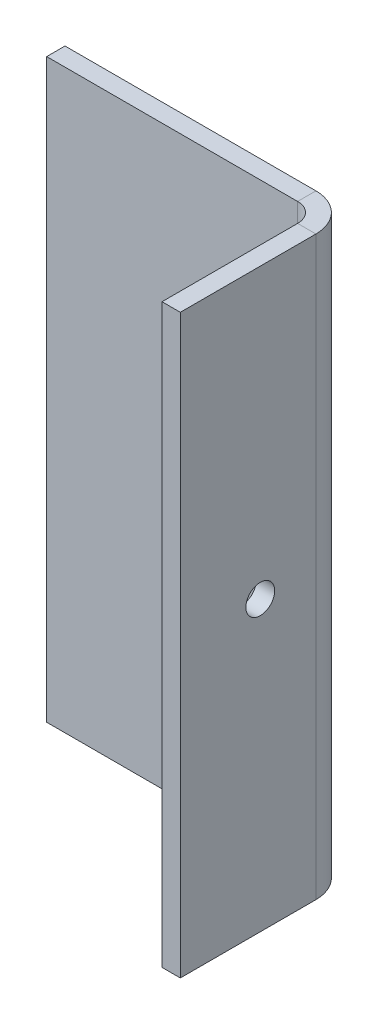
ISO-10303-21;
HEADER;
FILE_DESCRIPTION(('STEP AP214'),'2;1');
FILE_NAME('part.step','',(''),(''),'','','');
FILE_SCHEMA(('AUTOMOTIVE_DESIGN { 1 0 10303 214 1 1 1 1 }'));
ENDSEC;
DATA;
#1=APPLICATION_CONTEXT('core data for automotive mechanical design processes');
#2=APPLICATION_PROTOCOL_DEFINITION('international standard','automotive_design',2000,#1);
#3=PRODUCT_CONTEXT('',#1,'mechanical');
#4=PRODUCT('Part','Part','',(#3));
#5=PRODUCT_RELATED_PRODUCT_CATEGORY('part','',(#4));
#6=PRODUCT_DEFINITION_FORMATION('','',#4);
#7=PRODUCT_DEFINITION_CONTEXT('part definition',#1,'design');
#8=PRODUCT_DEFINITION('design','',#6,#7);
#9=PRODUCT_DEFINITION_SHAPE('','',#8);
#10=(LENGTH_UNIT() NAMED_UNIT(*) SI_UNIT(.MILLI.,.METRE.));
#11=(NAMED_UNIT(*) PLANE_ANGLE_UNIT() SI_UNIT($,.RADIAN.));
#12=(NAMED_UNIT(*) SI_UNIT($,.STERADIAN.) SOLID_ANGLE_UNIT());
#13=UNCERTAINTY_MEASURE_WITH_UNIT(LENGTH_MEASURE(1.E-05),#10,'distance_accuracy_value','');
#14=(GEOMETRIC_REPRESENTATION_CONTEXT(3) GLOBAL_UNCERTAINTY_ASSIGNED_CONTEXT((#13)) GLOBAL_UNIT_ASSIGNED_CONTEXT((#10,
#11,#12)) REPRESENTATION_CONTEXT('',''));
#15=CARTESIAN_POINT('',(0.,0.,0.));
#16=DIRECTION('',(0.,0.,1.));
#17=DIRECTION('',(1.,0.,0.));
#18=AXIS2_PLACEMENT_3D('',#15,#16,#17);
#19=CARTESIAN_POINT('',(-25.,50.,-3.175));
#20=DIRECTION('',(0.,1.,0.));
#21=DIRECTION('',(0.,0.,1.));
#22=AXIS2_PLACEMENT_3D('',#19,#20,#21);
#23=PLANE('',#22);
#24=DIRECTION('',(-1.,0.,0.));
#25=VECTOR('',#24,1.);
#26=CARTESIAN_POINT('',(-25.,50.,0.));
#27=LINE('',#26,#25);
#28=CARTESIAN_POINT('',(18.523,50.,0.));
#29=VERTEX_POINT('',#28);
#30=CARTESIAN_POINT('',(-25.,50.,0.));
#31=VERTEX_POINT('',#30);
#32=EDGE_CURVE('E91',#29,#31,#27,.T.);
#33=ORIENTED_EDGE('',*,*,#32,.F.);
#34=DIRECTION('',(0.,0.,-1.));
#35=VECTOR('',#34,1.);
#36=CARTESIAN_POINT('',(18.523,50.,0.));
#37=LINE('',#36,#35);
#38=CARTESIAN_POINT('',(18.523,50.,-3.175));
#39=VERTEX_POINT('',#38);
#40=EDGE_CURVE('E107',#29,#39,#37,.T.);
#41=ORIENTED_EDGE('',*,*,#40,.T.);
#42=DIRECTION('',(-1.,0.,0.));
#43=VECTOR('',#42,1.);
#44=CARTESIAN_POINT('',(-25.,50.,-3.175));
#45=LINE('',#44,#43);
#46=CARTESIAN_POINT('',(-25.,50.,-3.175));
#47=VERTEX_POINT('',#46);
#48=EDGE_CURVE('E80',#39,#47,#45,.T.);
#49=ORIENTED_EDGE('',*,*,#48,.T.);
#50=DIRECTION('',(0.,0.,1.));
#51=VECTOR('',#50,1.);
#52=CARTESIAN_POINT('',(-25.,50.,-3.175));
#53=LINE('',#52,#51);
#54=EDGE_CURVE('E13',#47,#31,#53,.T.);
#55=ORIENTED_EDGE('',*,*,#54,.T.);
#56=EDGE_LOOP('',(#33,#41,#49,#55));
#57=FACE_BOUND('',#56,.T.);
#58=ADVANCED_FACE('F57',(#57),#23,.T.);
#59=CARTESIAN_POINT('',(0.,0.,-3.175));
#60=DIRECTION('',(0.,0.,1.));
#61=DIRECTION('',(1.,0.,0.));
#62=AXIS2_PLACEMENT_3D('',#59,#60,#61);
#63=PLANE('',#62);
#64=DIRECTION('',(0.,1.,0.));
#65=VECTOR('',#64,1.);
#66=CARTESIAN_POINT('',(18.523,50.,-3.175));
#67=LINE('',#66,#65);
#68=CARTESIAN_POINT('',(18.523,-50.,-3.175));
#69=VERTEX_POINT('',#68);
#70=EDGE_CURVE('E128',#39,#69,#67,.F.);
#71=ORIENTED_EDGE('',*,*,#70,.T.);
#72=DIRECTION('',(1.,0.,0.));
#73=VECTOR('',#72,1.);
#74=CARTESIAN_POINT('',(-25.,-50.,-3.175));
#75=LINE('',#74,#73);
#76=CARTESIAN_POINT('',(-25.,-50.,-3.175));
#77=VERTEX_POINT('',#76);
#78=EDGE_CURVE('E111',#77,#69,#75,.T.);
#79=ORIENTED_EDGE('',*,*,#78,.F.);
#80=DIRECTION('',(0.,-1.,0.));
#81=VECTOR('',#80,1.);
#82=CARTESIAN_POINT('',(-25.,50.,-3.175));
#83=LINE('',#82,#81);
#84=EDGE_CURVE('E96',#47,#77,#83,.T.);
#85=ORIENTED_EDGE('',*,*,#84,.F.);
#86=ORIENTED_EDGE('',*,*,#48,.F.);
#87=EDGE_LOOP('',(#71,#79,#85,#86));
#88=FACE_BOUND('',#87,.T.);
#89=ADVANCED_FACE('F224',(#88),#63,.F.);
#90=CARTESIAN_POINT('',(0.,0.,0.));
#91=DIRECTION('',(0.,0.,1.));
#92=DIRECTION('',(1.,0.,0.));
#93=AXIS2_PLACEMENT_3D('',#90,#91,#92);
#94=PLANE('',#93);
#95=DIRECTION('',(1.,0.,0.));
#96=VECTOR('',#95,1.);
#97=CARTESIAN_POINT('',(-25.,-50.,0.));
#98=LINE('',#97,#96);
#99=CARTESIAN_POINT('',(-25.,-50.,0.));
#100=VERTEX_POINT('',#99);
#101=CARTESIAN_POINT('',(18.523,-50.,0.));
#102=VERTEX_POINT('',#101);
#103=EDGE_CURVE('E97',#100,#102,#98,.T.);
#104=ORIENTED_EDGE('',*,*,#103,.T.);
#105=DIRECTION('',(0.,1.,0.));
#106=VECTOR('',#105,1.);
#107=CARTESIAN_POINT('',(18.523,50.,0.));
#108=LINE('',#107,#106);
#109=EDGE_CURVE('E72',#29,#102,#108,.F.);
#110=ORIENTED_EDGE('',*,*,#109,.F.);
#111=ORIENTED_EDGE('',*,*,#32,.T.);
#112=DIRECTION('',(0.,-1.,0.));
#113=VECTOR('',#112,1.);
#114=CARTESIAN_POINT('',(-25.,50.,0.));
#115=LINE('',#114,#113);
#116=EDGE_CURVE('E94',#31,#100,#115,.T.);
#117=ORIENTED_EDGE('',*,*,#116,.T.);
#118=EDGE_LOOP('',(#104,#110,#111,#117));
#119=FACE_BOUND('',#118,.T.);
#120=ADVANCED_FACE('F92',(#119),#94,.T.);
#121=CARTESIAN_POINT('',(-25.,50.,-3.175));
#122=DIRECTION('',(-1.,0.,0.));
#123=DIRECTION('',(0.,0.,1.));
#124=AXIS2_PLACEMENT_3D('',#121,#122,#123);
#125=PLANE('',#124);
#126=ORIENTED_EDGE('',*,*,#116,.F.);
#127=ORIENTED_EDGE('',*,*,#54,.F.);
#128=ORIENTED_EDGE('',*,*,#84,.T.);
#129=DIRECTION('',(0.,0.,1.));
#130=VECTOR('',#129,1.);
#131=CARTESIAN_POINT('',(-25.,-50.,-3.175));
#132=LINE('',#131,#130);
#133=EDGE_CURVE('E61',#77,#100,#132,.T.);
#134=ORIENTED_EDGE('',*,*,#133,.T.);
#135=EDGE_LOOP('',(#126,#127,#128,#134));
#136=FACE_BOUND('',#135,.T.);
#137=ADVANCED_FACE('F59',(#136),#125,.T.);
#138=CARTESIAN_POINT('',(-25.,-50.,-3.175));
#139=DIRECTION('',(0.,-1.,0.));
#140=DIRECTION('',(0.,0.,-1.));
#141=AXIS2_PLACEMENT_3D('',#138,#139,#140);
#142=PLANE('',#141);
#143=DIRECTION('',(0.,0.,-1.));
#144=VECTOR('',#143,1.);
#145=CARTESIAN_POINT('',(18.523,-50.,0.));
#146=LINE('',#145,#144);
#147=EDGE_CURVE('E103',#102,#69,#146,.T.);
#148=ORIENTED_EDGE('',*,*,#147,.F.);
#149=ORIENTED_EDGE('',*,*,#103,.F.);
#150=ORIENTED_EDGE('',*,*,#133,.F.);
#151=ORIENTED_EDGE('',*,*,#78,.T.);
#152=EDGE_LOOP('',(#148,#149,#150,#151));
#153=FACE_BOUND('',#152,.T.);
#154=ADVANCED_FACE('F226',(#153),#142,.T.);
#155=CARTESIAN_POINT('',(18.523,-50.,3.302));
#156=DIRECTION('',(0.,-1.,0.));
#157=DIRECTION('',(0.,0.,-1.));
#158=AXIS2_PLACEMENT_3D('',#155,#156,#157);
#159=PLANE('',#158);
#160=DIRECTION('',(-1.,0.,0.));
#161=VECTOR('',#160,1.);
#162=CARTESIAN_POINT('',(25.,-50.,3.30199999999998));
#163=LINE('',#162,#161);
#164=CARTESIAN_POINT('',(21.825,-50.,3.30199999999999));
#165=VERTEX_POINT('',#164);
#166=CARTESIAN_POINT('',(25.,-50.,3.30199999999998));
#167=VERTEX_POINT('',#166);
#168=EDGE_CURVE('E133',#165,#167,#163,.F.);
#169=ORIENTED_EDGE('',*,*,#168,.F.);
#170=CARTESIAN_POINT('',(18.523,-50.,3.302));
#171=DIRECTION('',(0.,1.,0.));
#172=DIRECTION('',(0.,0.,1.));
#173=AXIS2_PLACEMENT_3D('',#170,#171,#172);
#174=CIRCLE('',#173,3.302);
#175=EDGE_CURVE('E122',#102,#165,#174,.F.);
#176=ORIENTED_EDGE('',*,*,#175,.F.);
#177=ORIENTED_EDGE('',*,*,#147,.T.);
#178=CARTESIAN_POINT('',(18.523,-50.,3.302));
#179=DIRECTION('',(0.,1.,0.));
#180=DIRECTION('',(0.,0.,1.));
#181=AXIS2_PLACEMENT_3D('',#178,#179,#180);
#182=CIRCLE('',#181,6.477);
#183=EDGE_CURVE('E115',#69,#167,#182,.F.);
#184=ORIENTED_EDGE('',*,*,#183,.T.);
#185=EDGE_LOOP('',(#169,#176,#177,#184));
#186=FACE_BOUND('',#185,.T.);
#187=ADVANCED_FACE('F229',(#186),#159,.T.);
#188=CARTESIAN_POINT('',(18.523,50.,3.302));
#189=DIRECTION('',(0.,-1.,0.));
#190=DIRECTION('',(0.,0.,-1.));
#191=AXIS2_PLACEMENT_3D('',#188,#189,#190);
#192=PLANE('',#191);
#193=CARTESIAN_POINT('',(18.523,50.,3.302));
#194=DIRECTION('',(0.,1.,0.));
#195=DIRECTION('',(0.,0.,1.));
#196=AXIS2_PLACEMENT_3D('',#193,#194,#195);
#197=CIRCLE('',#196,3.302);
#198=CARTESIAN_POINT('',(21.825,50.,3.30199999999999));
#199=VERTEX_POINT('',#198);
#200=EDGE_CURVE('E117',#199,#29,#197,.T.);
#201=ORIENTED_EDGE('',*,*,#200,.F.);
#202=DIRECTION('',(-1.,0.,0.));
#203=VECTOR('',#202,1.);
#204=CARTESIAN_POINT('',(21.825,50.,3.30199999999999));
#205=LINE('',#204,#203);
#206=CARTESIAN_POINT('',(25.,50.,3.30199999999998));
#207=VERTEX_POINT('',#206);
#208=EDGE_CURVE('E140',#199,#207,#205,.F.);
#209=ORIENTED_EDGE('',*,*,#208,.T.);
#210=CARTESIAN_POINT('',(18.523,50.,3.302));
#211=DIRECTION('',(0.,1.,0.));
#212=DIRECTION('',(0.,0.,1.));
#213=AXIS2_PLACEMENT_3D('',#210,#211,#212);
#214=CIRCLE('',#213,6.477);
#215=EDGE_CURVE('E125',#207,#39,#214,.T.);
#216=ORIENTED_EDGE('',*,*,#215,.T.);
#217=ORIENTED_EDGE('',*,*,#40,.F.);
#218=EDGE_LOOP('',(#201,#209,#216,#217));
#219=FACE_BOUND('',#218,.T.);
#220=ADVANCED_FACE('F233',(#219),#192,.F.);
#221=CARTESIAN_POINT('',(18.523,50.,3.302));
#222=DIRECTION('',(0.,1.,0.));
#223=DIRECTION('',(1.,0.,0.));
#224=AXIS2_PLACEMENT_3D('',#221,#222,#223);
#225=CYLINDRICAL_SURFACE('',#224,6.477);
#226=ORIENTED_EDGE('',*,*,#70,.F.);
#227=ORIENTED_EDGE('',*,*,#215,.F.);
#228=DIRECTION('',(0.,1.,0.));
#229=VECTOR('',#228,1.);
#230=CARTESIAN_POINT('',(25.,-50.,3.30199999999998));
#231=LINE('',#230,#229);
#232=EDGE_CURVE('E143',#207,#167,#231,.F.);
#233=ORIENTED_EDGE('',*,*,#232,.T.);
#234=ORIENTED_EDGE('',*,*,#183,.F.);
#235=EDGE_LOOP('',(#226,#227,#233,#234));
#236=FACE_BOUND('',#235,.T.);
#237=ADVANCED_FACE('F230',(#236),#225,.T.);
#238=CARTESIAN_POINT('',(18.523,50.,3.302));
#239=DIRECTION('',(0.,1.,0.));
#240=DIRECTION('',(1.,0.,0.));
#241=AXIS2_PLACEMENT_3D('',#238,#239,#240);
#242=CYLINDRICAL_SURFACE('',#241,3.302);
#243=ORIENTED_EDGE('',*,*,#109,.T.);
#244=ORIENTED_EDGE('',*,*,#175,.T.);
#245=DIRECTION('',(0.,1.,0.));
#246=VECTOR('',#245,1.);
#247=CARTESIAN_POINT('',(21.825,-50.,3.30199999999999));
#248=LINE('',#247,#246);
#249=EDGE_CURVE('E136',#165,#199,#248,.T.);
#250=ORIENTED_EDGE('',*,*,#249,.T.);
#251=ORIENTED_EDGE('',*,*,#200,.T.);
#252=EDGE_LOOP('',(#243,#244,#250,#251));
#253=FACE_BOUND('',#252,.T.);
#254=ADVANCED_FACE('F232',(#253),#242,.F.);
#255=CARTESIAN_POINT('',(25.,-50.,0.));
#256=DIRECTION('',(0.,1.,0.));
#257=DIRECTION('',(0.,0.,1.));
#258=AXIS2_PLACEMENT_3D('',#255,#256,#257);
#259=PLANE('',#258);
#260=ORIENTED_EDGE('',*,*,#168,.T.);
#261=DIRECTION('',(0.,0.,-1.));
#262=VECTOR('',#261,1.);
#263=CARTESIAN_POINT('',(25.,-50.,0.));
#264=LINE('',#263,#262);
#265=CARTESIAN_POINT('',(25.0000000000001,-50.,26.825));
#266=VERTEX_POINT('',#265);
#267=EDGE_CURVE('E155',#266,#167,#264,.T.);
#268=ORIENTED_EDGE('',*,*,#267,.F.);
#269=DIRECTION('',(-1.,0.,0.));
#270=VECTOR('',#269,1.);
#271=CARTESIAN_POINT('',(25.0000000000001,-50.,26.825));
#272=LINE('',#271,#270);
#273=CARTESIAN_POINT('',(21.8250000000001,-50.,26.825));
#274=VERTEX_POINT('',#273);
#275=EDGE_CURVE('E164',#266,#274,#272,.T.);
#276=ORIENTED_EDGE('',*,*,#275,.T.);
#277=DIRECTION('',(0.,0.,1.));
#278=VECTOR('',#277,1.);
#279=CARTESIAN_POINT('',(21.825,-50.,0.));
#280=LINE('',#279,#278);
#281=EDGE_CURVE('E146',#274,#165,#280,.F.);
#282=ORIENTED_EDGE('',*,*,#281,.T.);
#283=EDGE_LOOP('',(#260,#268,#276,#282));
#284=FACE_BOUND('',#283,.T.);
#285=ADVANCED_FACE('F239',(#284),#259,.F.);
#286=CARTESIAN_POINT('',(25.0000000000001,50.,26.825));
#287=DIRECTION('',(0.,-1.,0.));
#288=DIRECTION('',(0.,0.,-1.));
#289=AXIS2_PLACEMENT_3D('',#286,#287,#288);
#290=PLANE('',#289);
#291=ORIENTED_EDGE('',*,*,#208,.F.);
#292=DIRECTION('',(0.,0.,-1.));
#293=VECTOR('',#292,1.);
#294=CARTESIAN_POINT('',(21.8250000000001,50.,26.825));
#295=LINE('',#294,#293);
#296=CARTESIAN_POINT('',(21.8250000000001,50.,26.825));
#297=VERTEX_POINT('',#296);
#298=EDGE_CURVE('E149',#199,#297,#295,.F.);
#299=ORIENTED_EDGE('',*,*,#298,.T.);
#300=DIRECTION('',(-1.,0.,0.));
#301=VECTOR('',#300,1.);
#302=CARTESIAN_POINT('',(25.0000000000001,50.,26.825));
#303=LINE('',#302,#301);
#304=CARTESIAN_POINT('',(25.0000000000001,50.,26.825));
#305=VERTEX_POINT('',#304);
#306=EDGE_CURVE('E120',#305,#297,#303,.T.);
#307=ORIENTED_EDGE('',*,*,#306,.F.);
#308=DIRECTION('',(0.,0.,1.));
#309=VECTOR('',#308,1.);
#310=CARTESIAN_POINT('',(25.,50.,0.));
#311=LINE('',#310,#309);
#312=EDGE_CURVE('E158',#207,#305,#311,.T.);
#313=ORIENTED_EDGE('',*,*,#312,.F.);
#314=EDGE_LOOP('',(#291,#299,#307,#313));
#315=FACE_BOUND('',#314,.T.);
#316=ADVANCED_FACE('F182',(#315),#290,.F.);
#317=CARTESIAN_POINT('',(25.,0.,0.));
#318=DIRECTION('',(-1.,0.,0.));
#319=DIRECTION('',(0.,0.,1.));
#320=AXIS2_PLACEMENT_3D('',#317,#318,#319);
#321=PLANE('',#320);
#322=CARTESIAN_POINT('',(25.0000000000001,0.,12.954));
#323=DIRECTION('',(1.,0.,0.));
#324=DIRECTION('',(0.,0.,-1.));
#325=AXIS2_PLACEMENT_3D('',#322,#323,#324);
#326=CIRCLE('',#325,2.5);
#327=CARTESIAN_POINT('',(25.,0.,10.454));
#328=VERTEX_POINT('',#327);
#329=EDGE_CURVE('E171',#328,#328,#326,.T.);
#330=ORIENTED_EDGE('',*,*,#329,.F.);
#331=EDGE_LOOP('',(#330));
#332=FACE_BOUND('',#331,.T.);
#333=ORIENTED_EDGE('',*,*,#232,.F.);
#334=ORIENTED_EDGE('',*,*,#312,.T.);
#335=DIRECTION('',(0.,-1.,0.));
#336=VECTOR('',#335,1.);
#337=CARTESIAN_POINT('',(25.0000000000001,0.,26.825));
#338=LINE('',#337,#336);
#339=EDGE_CURVE('E161',#305,#266,#338,.T.);
#340=ORIENTED_EDGE('',*,*,#339,.T.);
#341=ORIENTED_EDGE('',*,*,#267,.T.);
#342=EDGE_LOOP('',(#333,#334,#340,#341));
#343=FACE_BOUND('',#342,.T.);
#344=ADVANCED_FACE('F178',(#332,#343),#321,.F.);
#345=CARTESIAN_POINT('',(21.825,0.,0.));
#346=DIRECTION('',(-1.,0.,0.));
#347=DIRECTION('',(0.,0.,1.));
#348=AXIS2_PLACEMENT_3D('',#345,#346,#347);
#349=PLANE('',#348);
#350=CARTESIAN_POINT('',(21.8250000000001,0.,12.954));
#351=DIRECTION('',(-1.,0.,0.));
#352=DIRECTION('',(0.,0.,1.));
#353=AXIS2_PLACEMENT_3D('',#350,#351,#352);
#354=CIRCLE('',#353,2.5);
#355=CARTESIAN_POINT('',(21.8250000000001,0.,15.454));
#356=VERTEX_POINT('',#355);
#357=EDGE_CURVE('E137',#356,#356,#354,.T.);
#358=ORIENTED_EDGE('',*,*,#357,.F.);
#359=EDGE_LOOP('',(#358));
#360=FACE_BOUND('',#359,.T.);
#361=ORIENTED_EDGE('',*,*,#298,.F.);
#362=ORIENTED_EDGE('',*,*,#249,.F.);
#363=ORIENTED_EDGE('',*,*,#281,.F.);
#364=DIRECTION('',(0.,1.,0.));
#365=VECTOR('',#364,1.);
#366=CARTESIAN_POINT('',(21.8250000000001,-50.,26.825));
#367=LINE('',#366,#365);
#368=EDGE_CURVE('E152',#297,#274,#367,.F.);
#369=ORIENTED_EDGE('',*,*,#368,.F.);
#370=EDGE_LOOP('',(#361,#362,#363,#369));
#371=FACE_BOUND('',#370,.T.);
#372=ADVANCED_FACE('F181',(#360,#371),#349,.T.);
#373=CARTESIAN_POINT('',(25.0000000000001,-50.,26.825));
#374=DIRECTION('',(0.,0.,-1.));
#375=DIRECTION('',(-1.,0.,0.));
#376=AXIS2_PLACEMENT_3D('',#373,#374,#375);
#377=PLANE('',#376);
#378=ORIENTED_EDGE('',*,*,#368,.T.);
#379=ORIENTED_EDGE('',*,*,#275,.F.);
#380=ORIENTED_EDGE('',*,*,#339,.F.);
#381=ORIENTED_EDGE('',*,*,#306,.T.);
#382=EDGE_LOOP('',(#378,#379,#380,#381));
#383=FACE_BOUND('',#382,.T.);
#384=ADVANCED_FACE('F207',(#383),#377,.F.);
#385=CARTESIAN_POINT('',(25.0000000000001,0.,12.954));
#386=DIRECTION('',(1.,0.,0.));
#387=DIRECTION('',(0.,0.,-1.));
#388=AXIS2_PLACEMENT_3D('',#385,#386,#387);
#389=CYLINDRICAL_SURFACE('',#388,2.5);
#390=ORIENTED_EDGE('',*,*,#329,.T.);
#391=EDGE_LOOP('',(#390));
#392=FACE_BOUND('',#391,.T.);
#393=ORIENTED_EDGE('',*,*,#357,.T.);
#394=EDGE_LOOP('',(#393));
#395=FACE_BOUND('',#394,.T.);
#396=ADVANCED_FACE('F175',(#392,#395),#389,.F.);
#397=CLOSED_SHELL('',(#58,#89,#120,#137,#154,#187,#220,#237,#254,#285,#316,#344,#372,#384,#396));
#398=MANIFOLD_SOLID_BREP('B2',#397);
#399=ADVANCED_BREP_SHAPE_REPRESENTATION('',(#18,#398),#14);
#400=SHAPE_DEFINITION_REPRESENTATION(#9,#399);
ENDSEC;
END-ISO-10303-21;
